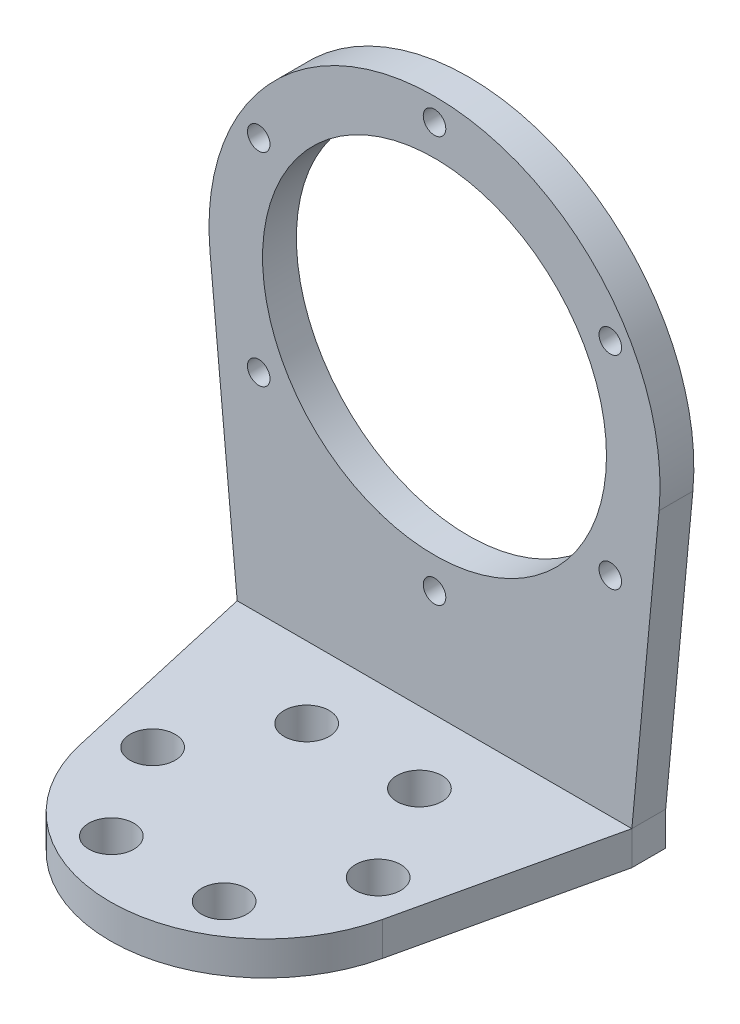
ISO-10303-21;
HEADER;
FILE_DESCRIPTION(('STEP AP214'),'2;1');
FILE_NAME('part.step','',(''),(''),'','','');
FILE_SCHEMA(('AUTOMOTIVE_DESIGN { 1 0 10303 214 1 1 1 1 }'));
ENDSEC;
DATA;
#1=APPLICATION_CONTEXT('core data for automotive mechanical design processes');
#2=APPLICATION_PROTOCOL_DEFINITION('international standard','automotive_design',2000,#1);
#3=PRODUCT_CONTEXT('',#1,'mechanical');
#4=PRODUCT('Part','Part','',(#3));
#5=PRODUCT_RELATED_PRODUCT_CATEGORY('part','',(#4));
#6=PRODUCT_DEFINITION_FORMATION('','',#4);
#7=PRODUCT_DEFINITION_CONTEXT('part definition',#1,'design');
#8=PRODUCT_DEFINITION('design','',#6,#7);
#9=PRODUCT_DEFINITION_SHAPE('','',#8);
#10=(LENGTH_UNIT() NAMED_UNIT(*) SI_UNIT(.MILLI.,.METRE.));
#11=(NAMED_UNIT(*) PLANE_ANGLE_UNIT() SI_UNIT($,.RADIAN.));
#12=(NAMED_UNIT(*) SI_UNIT($,.STERADIAN.) SOLID_ANGLE_UNIT());
#13=UNCERTAINTY_MEASURE_WITH_UNIT(LENGTH_MEASURE(1.E-05),#10,'distance_accuracy_value','');
#14=(GEOMETRIC_REPRESENTATION_CONTEXT(3) GLOBAL_UNCERTAINTY_ASSIGNED_CONTEXT((#13)) GLOBAL_UNIT_ASSIGNED_CONTEXT((#10,
#11,#12)) REPRESENTATION_CONTEXT('',''));
#15=CARTESIAN_POINT('',(0.,0.,0.));
#16=DIRECTION('',(0.,0.,1.));
#17=DIRECTION('',(1.,0.,0.));
#18=AXIS2_PLACEMENT_3D('',#15,#16,#17);
#19=CARTESIAN_POINT('',(35.,0.,28.75));
#20=DIRECTION('',(0.,1.,0.));
#21=DIRECTION('',(1.,0.,0.));
#22=AXIS2_PLACEMENT_3D('',#19,#20,#21);
#23=PLANE('',#22);
#24=CARTESIAN_POINT('',(45.,0.,47.3205080756888));
#25=DIRECTION('',(0.,1.,0.));
#26=DIRECTION('',(1.,0.,0.));
#27=AXIS2_PLACEMENT_3D('',#24,#25,#26);
#28=CIRCLE('',#27,4.);
#29=CARTESIAN_POINT('',(41.,0.,47.3205080756888));
#30=VERTEX_POINT('',#29);
#31=EDGE_CURVE('E246',#30,#30,#28,.T.);
#32=ORIENTED_EDGE('',*,*,#31,.T.);
#33=EDGE_LOOP('',(#32));
#34=FACE_BOUND('',#33,.T.);
#35=CARTESIAN_POINT('',(45.,0.,12.6794919243112));
#36=DIRECTION('',(0.,1.,0.));
#37=DIRECTION('',(1.,0.,0.));
#38=AXIS2_PLACEMENT_3D('',#35,#36,#37);
#39=CIRCLE('',#38,4.);
#40=CARTESIAN_POINT('',(41.,0.,12.6794919243112));
#41=VERTEX_POINT('',#40);
#42=EDGE_CURVE('E346',#41,#41,#39,.T.);
#43=ORIENTED_EDGE('',*,*,#42,.T.);
#44=EDGE_LOOP('',(#43));
#45=FACE_BOUND('',#44,.T.);
#46=CARTESIAN_POINT('',(25.,0.,12.6794919243112));
#47=DIRECTION('',(0.,1.,0.));
#48=DIRECTION('',(1.,0.,0.));
#49=AXIS2_PLACEMENT_3D('',#46,#47,#48);
#50=CIRCLE('',#49,4.);
#51=CARTESIAN_POINT('',(21.,0.,12.6794919243112));
#52=VERTEX_POINT('',#51);
#53=EDGE_CURVE('E374',#52,#52,#50,.T.);
#54=ORIENTED_EDGE('',*,*,#53,.T.);
#55=EDGE_LOOP('',(#54));
#56=FACE_BOUND('',#55,.T.);
#57=CARTESIAN_POINT('',(25.,0.,47.3205080756888));
#58=DIRECTION('',(0.,1.,0.));
#59=DIRECTION('',(1.,0.,0.));
#60=AXIS2_PLACEMENT_3D('',#57,#58,#59);
#61=CIRCLE('',#60,4.);
#62=CARTESIAN_POINT('',(21.,0.,47.3205080756888));
#63=VERTEX_POINT('',#62);
#64=EDGE_CURVE('E136',#63,#63,#61,.T.);
#65=ORIENTED_EDGE('',*,*,#64,.T.);
#66=EDGE_LOOP('',(#65));
#67=FACE_BOUND('',#66,.T.);
#68=CARTESIAN_POINT('',(55.,0.,30.));
#69=DIRECTION('',(0.,1.,0.));
#70=DIRECTION('',(1.,0.,0.));
#71=AXIS2_PLACEMENT_3D('',#68,#69,#70);
#72=CIRCLE('',#71,4.);
#73=CARTESIAN_POINT('',(51.,0.,30.));
#74=VERTEX_POINT('',#73);
#75=EDGE_CURVE('E338',#74,#74,#72,.T.);
#76=ORIENTED_EDGE('',*,*,#75,.T.);
#77=EDGE_LOOP('',(#76));
#78=FACE_BOUND('',#77,.T.);
#79=CARTESIAN_POINT('',(15.,0.,30.));
#80=DIRECTION('',(0.,1.,0.));
#81=DIRECTION('',(1.,0.,0.));
#82=AXIS2_PLACEMENT_3D('',#79,#80,#81);
#83=CIRCLE('',#82,4.);
#84=CARTESIAN_POINT('',(11.,0.,30.));
#85=VERTEX_POINT('',#84);
#86=EDGE_CURVE('E287',#85,#85,#83,.T.);
#87=ORIENTED_EDGE('',*,*,#86,.T.);
#88=EDGE_LOOP('',(#87));
#89=FACE_BOUND('',#88,.T.);
#90=DIRECTION('',(0.221120824168478,0.,-0.975246420715838));
#91=VECTOR('',#90,1.);
#92=CARTESIAN_POINT('',(61.8192765696855,0.,36.0808226646331));
#93=LINE('',#92,#91);
#94=CARTESIAN_POINT('',(61.8192765696855,0.,36.0808226646331));
#95=VERTEX_POINT('',#94);
#96=CARTESIAN_POINT('',(70.,0.,0.));
#97=VERTEX_POINT('',#96);
#98=EDGE_CURVE('E28',#95,#97,#93,.T.);
#99=ORIENTED_EDGE('',*,*,#98,.F.);
#100=CARTESIAN_POINT('',(35.,0.,30.));
#101=DIRECTION('',(0.,1.,0.));
#102=DIRECTION('',(-0.975246420715838,0.,0.221120824168478));
#103=AXIS2_PLACEMENT_3D('',#100,#101,#102);
#104=CIRCLE('',#103,27.5);
#105=CARTESIAN_POINT('',(8.18072343031444,0.,36.0808226646331));
#106=VERTEX_POINT('',#105);
#107=EDGE_CURVE('E238',#106,#95,#104,.T.);
#108=ORIENTED_EDGE('',*,*,#107,.F.);
#109=DIRECTION('',(0.221120824168477,0.,0.975246420715838));
#110=VECTOR('',#109,1.);
#111=CARTESIAN_POINT('',(0.,0.,0.));
#112=LINE('',#111,#110);
#113=CARTESIAN_POINT('',(0.,0.,0.));
#114=VERTEX_POINT('',#113);
#115=EDGE_CURVE('E221',#114,#106,#112,.T.);
#116=ORIENTED_EDGE('',*,*,#115,.F.);
#117=DIRECTION('',(0.,0.,-1.));
#118=VECTOR('',#117,1.);
#119=CARTESIAN_POINT('',(0.,0.,0.));
#120=LINE('',#119,#118);
#121=CARTESIAN_POINT('',(0.,0.,-6.));
#122=VERTEX_POINT('',#121);
#123=EDGE_CURVE('E271',#114,#122,#120,.T.);
#124=ORIENTED_EDGE('',*,*,#123,.T.);
#125=DIRECTION('',(1.,0.,0.));
#126=VECTOR('',#125,1.);
#127=CARTESIAN_POINT('',(0.,0.,-6.));
#128=LINE('',#127,#126);
#129=CARTESIAN_POINT('',(70.,0.,-6.));
#130=VERTEX_POINT('',#129);
#131=EDGE_CURVE('E300',#122,#130,#128,.T.);
#132=ORIENTED_EDGE('',*,*,#131,.T.);
#133=DIRECTION('',(0.,0.,1.));
#134=VECTOR('',#133,1.);
#135=CARTESIAN_POINT('',(70.,0.,-6.));
#136=LINE('',#135,#134);
#137=EDGE_CURVE('E422',#130,#97,#136,.T.);
#138=ORIENTED_EDGE('',*,*,#137,.T.);
#139=EDGE_LOOP('',(#99,#108,#116,#124,#132,#138));
#140=FACE_BOUND('',#139,.T.);
#141=ADVANCED_FACE('F17',(#34,#45,#56,#67,#78,#89,#140),#23,.F.);
#142=CARTESIAN_POINT('',(35.,6.,28.75));
#143=DIRECTION('',(0.,1.,0.));
#144=DIRECTION('',(1.,0.,0.));
#145=AXIS2_PLACEMENT_3D('',#142,#143,#144);
#146=PLANE('',#145);
#147=CARTESIAN_POINT('',(45.,6.,47.3205080756888));
#148=DIRECTION('',(0.,-1.,0.));
#149=DIRECTION('',(1.,0.,0.));
#150=AXIS2_PLACEMENT_3D('',#147,#148,#149);
#151=CIRCLE('',#150,4.);
#152=CARTESIAN_POINT('',(41.,6.,47.3205080756888));
#153=VERTEX_POINT('',#152);
#154=EDGE_CURVE('E349',#153,#153,#151,.T.);
#155=ORIENTED_EDGE('',*,*,#154,.T.);
#156=EDGE_LOOP('',(#155));
#157=FACE_BOUND('',#156,.T.);
#158=CARTESIAN_POINT('',(45.,6.,12.6794919243112));
#159=DIRECTION('',(0.,-1.,0.));
#160=DIRECTION('',(1.,0.,0.));
#161=AXIS2_PLACEMENT_3D('',#158,#159,#160);
#162=CIRCLE('',#161,4.);
#163=CARTESIAN_POINT('',(41.,6.,12.6794919243112));
#164=VERTEX_POINT('',#163);
#165=EDGE_CURVE('E382',#164,#164,#162,.T.);
#166=ORIENTED_EDGE('',*,*,#165,.T.);
#167=EDGE_LOOP('',(#166));
#168=FACE_BOUND('',#167,.T.);
#169=CARTESIAN_POINT('',(25.,6.,12.6794919243112));
#170=DIRECTION('',(0.,-1.,0.));
#171=DIRECTION('',(1.,0.,0.));
#172=AXIS2_PLACEMENT_3D('',#169,#170,#171);
#173=CIRCLE('',#172,4.);
#174=CARTESIAN_POINT('',(21.,6.,12.6794919243112));
#175=VERTEX_POINT('',#174);
#176=EDGE_CURVE('E345',#175,#175,#173,.T.);
#177=ORIENTED_EDGE('',*,*,#176,.T.);
#178=EDGE_LOOP('',(#177));
#179=FACE_BOUND('',#178,.T.);
#180=CARTESIAN_POINT('',(25.,6.,47.3205080756888));
#181=DIRECTION('',(0.,-1.,0.));
#182=DIRECTION('',(1.,0.,0.));
#183=AXIS2_PLACEMENT_3D('',#180,#181,#182);
#184=CIRCLE('',#183,4.);
#185=CARTESIAN_POINT('',(21.,6.,47.3205080756888));
#186=VERTEX_POINT('',#185);
#187=EDGE_CURVE('E341',#186,#186,#184,.T.);
#188=ORIENTED_EDGE('',*,*,#187,.T.);
#189=EDGE_LOOP('',(#188));
#190=FACE_BOUND('',#189,.T.);
#191=CARTESIAN_POINT('',(55.,6.,30.));
#192=DIRECTION('',(0.,-1.,0.));
#193=DIRECTION('',(1.,0.,0.));
#194=AXIS2_PLACEMENT_3D('',#191,#192,#193);
#195=CIRCLE('',#194,4.);
#196=CARTESIAN_POINT('',(51.,6.,30.));
#197=VERTEX_POINT('',#196);
#198=EDGE_CURVE('E292',#197,#197,#195,.T.);
#199=ORIENTED_EDGE('',*,*,#198,.T.);
#200=EDGE_LOOP('',(#199));
#201=FACE_BOUND('',#200,.T.);
#202=CARTESIAN_POINT('',(15.,6.,30.));
#203=DIRECTION('',(0.,-1.,0.));
#204=DIRECTION('',(1.,0.,0.));
#205=AXIS2_PLACEMENT_3D('',#202,#203,#204);
#206=CIRCLE('',#205,4.);
#207=CARTESIAN_POINT('',(11.,6.,30.));
#208=VERTEX_POINT('',#207);
#209=EDGE_CURVE('E288',#208,#208,#206,.T.);
#210=ORIENTED_EDGE('',*,*,#209,.T.);
#211=EDGE_LOOP('',(#210));
#212=FACE_BOUND('',#211,.T.);
#213=DIRECTION('',(0.221120824168478,0.,-0.975246420715838));
#214=VECTOR('',#213,1.);
#215=CARTESIAN_POINT('',(61.8192765696855,6.,36.0808226646331));
#216=LINE('',#215,#214);
#217=CARTESIAN_POINT('',(61.8192765696855,6.,36.0808226646331));
#218=VERTEX_POINT('',#217);
#219=CARTESIAN_POINT('',(70.,6.,0.));
#220=VERTEX_POINT('',#219);
#221=EDGE_CURVE('E11',#218,#220,#216,.T.);
#222=ORIENTED_EDGE('',*,*,#221,.T.);
#223=DIRECTION('',(-1.,0.,0.));
#224=VECTOR('',#223,1.);
#225=CARTESIAN_POINT('',(70.,6.,0.));
#226=LINE('',#225,#224);
#227=CARTESIAN_POINT('',(0.,6.,0.));
#228=VERTEX_POINT('',#227);
#229=EDGE_CURVE('E297',#220,#228,#226,.T.);
#230=ORIENTED_EDGE('',*,*,#229,.T.);
#231=DIRECTION('',(0.221120824168477,0.,0.975246420715838));
#232=VECTOR('',#231,1.);
#233=CARTESIAN_POINT('',(0.,6.,0.));
#234=LINE('',#233,#232);
#235=CARTESIAN_POINT('',(8.18072343031444,6.,36.0808226646331));
#236=VERTEX_POINT('',#235);
#237=EDGE_CURVE('E42',#228,#236,#234,.T.);
#238=ORIENTED_EDGE('',*,*,#237,.T.);
#239=CARTESIAN_POINT('',(35.,6.,30.));
#240=DIRECTION('',(0.,1.,0.));
#241=DIRECTION('',(-0.975246420715838,0.,0.221120824168478));
#242=AXIS2_PLACEMENT_3D('',#239,#240,#241);
#243=CIRCLE('',#242,27.5);
#244=EDGE_CURVE('E239',#236,#218,#243,.T.);
#245=ORIENTED_EDGE('',*,*,#244,.T.);
#246=EDGE_LOOP('',(#222,#230,#238,#245));
#247=FACE_BOUND('',#246,.T.);
#248=ADVANCED_FACE('F682',(#157,#168,#179,#190,#201,#212,#247),#146,.T.);
#249=CARTESIAN_POINT('',(61.8192765696855,0.,36.0808226646331));
#250=DIRECTION('',(0.975246420715838,0.,0.221120824168478));
#251=DIRECTION('',(0.,-1.,0.));
#252=AXIS2_PLACEMENT_3D('',#249,#250,#251);
#253=PLANE('',#252);
#254=ORIENTED_EDGE('',*,*,#98,.T.);
#255=DIRECTION('',(0.,1.,0.));
#256=VECTOR('',#255,1.);
#257=CARTESIAN_POINT('',(70.,0.,0.));
#258=LINE('',#257,#256);
#259=EDGE_CURVE('E418',#97,#220,#258,.T.);
#260=ORIENTED_EDGE('',*,*,#259,.T.);
#261=ORIENTED_EDGE('',*,*,#221,.F.);
#262=DIRECTION('',(0.,1.,0.));
#263=VECTOR('',#262,1.);
#264=CARTESIAN_POINT('',(61.8192765696855,0.,36.0808226646331));
#265=LINE('',#264,#263);
#266=EDGE_CURVE('E245',#95,#218,#265,.T.);
#267=ORIENTED_EDGE('',*,*,#266,.F.);
#268=EDGE_LOOP('',(#254,#260,#261,#267));
#269=FACE_BOUND('',#268,.T.);
#270=ADVANCED_FACE('F681',(#269),#253,.T.);
#271=CARTESIAN_POINT('',(0.,0.,0.));
#272=DIRECTION('',(-0.975246420715838,0.,0.221120824168477));
#273=DIRECTION('',(0.,1.,0.));
#274=AXIS2_PLACEMENT_3D('',#271,#272,#273);
#275=PLANE('',#274);
#276=ORIENTED_EDGE('',*,*,#115,.T.);
#277=DIRECTION('',(0.,1.,0.));
#278=VECTOR('',#277,1.);
#279=CARTESIAN_POINT('',(8.18072343031444,0.,36.0808226646331));
#280=LINE('',#279,#278);
#281=EDGE_CURVE('E224',#106,#236,#280,.T.);
#282=ORIENTED_EDGE('',*,*,#281,.T.);
#283=ORIENTED_EDGE('',*,*,#237,.F.);
#284=DIRECTION('',(0.,1.,0.));
#285=VECTOR('',#284,1.);
#286=CARTESIAN_POINT('',(0.,0.,0.));
#287=LINE('',#286,#285);
#288=EDGE_CURVE('E227',#114,#228,#287,.T.);
#289=ORIENTED_EDGE('',*,*,#288,.F.);
#290=EDGE_LOOP('',(#276,#282,#283,#289));
#291=FACE_BOUND('',#290,.T.);
#292=ADVANCED_FACE('F223',(#291),#275,.T.);
#293=CARTESIAN_POINT('',(35.,0.,30.));
#294=DIRECTION('',(0.,1.,0.));
#295=DIRECTION('',(-0.975246420715838,0.,0.221120824168478));
#296=AXIS2_PLACEMENT_3D('',#293,#294,#295);
#297=CYLINDRICAL_SURFACE('',#296,27.5);
#298=ORIENTED_EDGE('',*,*,#107,.T.);
#299=ORIENTED_EDGE('',*,*,#266,.T.);
#300=ORIENTED_EDGE('',*,*,#244,.F.);
#301=ORIENTED_EDGE('',*,*,#281,.F.);
#302=EDGE_LOOP('',(#298,#299,#300,#301));
#303=FACE_BOUND('',#302,.T.);
#304=ADVANCED_FACE('F236',(#303),#297,.T.);
#305=CARTESIAN_POINT('',(45.,6.,47.3205080756888));
#306=DIRECTION('',(0.,-1.,0.));
#307=DIRECTION('',(1.,0.,0.));
#308=AXIS2_PLACEMENT_3D('',#305,#306,#307);
#309=CYLINDRICAL_SURFACE('',#308,4.);
#310=ORIENTED_EDGE('',*,*,#154,.F.);
#311=DIRECTION('',(0.,-1.,0.));
#312=VECTOR('',#311,1.);
#313=CARTESIAN_POINT('',(41.,6.,47.3205080756888));
#314=LINE('',#313,#312);
#315=EDGE_CURVE('E254',#153,#30,#314,.T.);
#316=ORIENTED_EDGE('',*,*,#315,.T.);
#317=ORIENTED_EDGE('',*,*,#31,.F.);
#318=ORIENTED_EDGE('',*,*,#315,.F.);
#319=EDGE_LOOP('',(#310,#316,#317,#318));
#320=FACE_BOUND('',#319,.T.);
#321=ADVANCED_FACE('F708',(#320),#309,.F.);
#322=CARTESIAN_POINT('',(45.,6.,12.6794919243112));
#323=DIRECTION('',(0.,-1.,0.));
#324=DIRECTION('',(1.,0.,0.));
#325=AXIS2_PLACEMENT_3D('',#322,#323,#324);
#326=CYLINDRICAL_SURFACE('',#325,4.);
#327=ORIENTED_EDGE('',*,*,#165,.F.);
#328=DIRECTION('',(0.,-1.,0.));
#329=VECTOR('',#328,1.);
#330=CARTESIAN_POINT('',(41.,6.,12.6794919243112));
#331=LINE('',#330,#329);
#332=EDGE_CURVE('E350',#164,#41,#331,.T.);
#333=ORIENTED_EDGE('',*,*,#332,.T.);
#334=ORIENTED_EDGE('',*,*,#42,.F.);
#335=ORIENTED_EDGE('',*,*,#332,.F.);
#336=EDGE_LOOP('',(#327,#333,#334,#335));
#337=FACE_BOUND('',#336,.T.);
#338=ADVANCED_FACE('F706',(#337),#326,.F.);
#339=CARTESIAN_POINT('',(25.,6.,12.6794919243112));
#340=DIRECTION('',(0.,-1.,0.));
#341=DIRECTION('',(1.,0.,0.));
#342=AXIS2_PLACEMENT_3D('',#339,#340,#341);
#343=CYLINDRICAL_SURFACE('',#342,4.);
#344=ORIENTED_EDGE('',*,*,#176,.F.);
#345=DIRECTION('',(0.,-1.,0.));
#346=VECTOR('',#345,1.);
#347=CARTESIAN_POINT('',(21.,6.,12.6794919243112));
#348=LINE('',#347,#346);
#349=EDGE_CURVE('E371',#175,#52,#348,.T.);
#350=ORIENTED_EDGE('',*,*,#349,.T.);
#351=ORIENTED_EDGE('',*,*,#53,.F.);
#352=ORIENTED_EDGE('',*,*,#349,.F.);
#353=EDGE_LOOP('',(#344,#350,#351,#352));
#354=FACE_BOUND('',#353,.T.);
#355=ADVANCED_FACE('F702',(#354),#343,.F.);
#356=CARTESIAN_POINT('',(25.,6.,47.3205080756888));
#357=DIRECTION('',(0.,-1.,0.));
#358=DIRECTION('',(1.,0.,0.));
#359=AXIS2_PLACEMENT_3D('',#356,#357,#358);
#360=CYLINDRICAL_SURFACE('',#359,4.);
#361=ORIENTED_EDGE('',*,*,#187,.F.);
#362=DIRECTION('',(0.,-1.,0.));
#363=VECTOR('',#362,1.);
#364=CARTESIAN_POINT('',(21.,6.,47.3205080756888));
#365=LINE('',#364,#363);
#366=EDGE_CURVE('E149',#186,#63,#365,.T.);
#367=ORIENTED_EDGE('',*,*,#366,.T.);
#368=ORIENTED_EDGE('',*,*,#64,.F.);
#369=ORIENTED_EDGE('',*,*,#366,.F.);
#370=EDGE_LOOP('',(#361,#367,#368,#369));
#371=FACE_BOUND('',#370,.T.);
#372=ADVANCED_FACE('F705',(#371),#360,.F.);
#373=CARTESIAN_POINT('',(55.,6.,30.));
#374=DIRECTION('',(0.,-1.,0.));
#375=DIRECTION('',(1.,0.,0.));
#376=AXIS2_PLACEMENT_3D('',#373,#374,#375);
#377=CYLINDRICAL_SURFACE('',#376,4.);
#378=ORIENTED_EDGE('',*,*,#198,.F.);
#379=DIRECTION('',(0.,-1.,0.));
#380=VECTOR('',#379,1.);
#381=CARTESIAN_POINT('',(51.,6.,30.));
#382=LINE('',#381,#380);
#383=EDGE_CURVE('E342',#197,#74,#382,.T.);
#384=ORIENTED_EDGE('',*,*,#383,.T.);
#385=ORIENTED_EDGE('',*,*,#75,.F.);
#386=ORIENTED_EDGE('',*,*,#383,.F.);
#387=EDGE_LOOP('',(#378,#384,#385,#386));
#388=FACE_BOUND('',#387,.T.);
#389=ADVANCED_FACE('F721',(#388),#377,.F.);
#390=CARTESIAN_POINT('',(15.,6.,30.));
#391=DIRECTION('',(0.,-1.,0.));
#392=DIRECTION('',(1.,0.,0.));
#393=AXIS2_PLACEMENT_3D('',#390,#391,#392);
#394=CYLINDRICAL_SURFACE('',#393,4.);
#395=ORIENTED_EDGE('',*,*,#209,.F.);
#396=DIRECTION('',(0.,-1.,0.));
#397=VECTOR('',#396,1.);
#398=CARTESIAN_POINT('',(11.,6.,30.));
#399=LINE('',#398,#397);
#400=EDGE_CURVE('E283',#208,#85,#399,.T.);
#401=ORIENTED_EDGE('',*,*,#400,.T.);
#402=ORIENTED_EDGE('',*,*,#86,.F.);
#403=ORIENTED_EDGE('',*,*,#400,.F.);
#404=EDGE_LOOP('',(#395,#401,#402,#403));
#405=FACE_BOUND('',#404,.T.);
#406=ADVANCED_FACE('F718',(#405),#394,.F.);
#407=CARTESIAN_POINT('',(35.,53.5,-6.));
#408=DIRECTION('',(0.,0.,1.));
#409=DIRECTION('',(1.,0.,0.));
#410=AXIS2_PLACEMENT_3D('',#407,#408,#409);
#411=PLANE('',#410);
#412=CARTESIAN_POINT('',(35.,61.,-6.));
#413=DIRECTION('',(0.,0.,1.));
#414=DIRECTION('',(-1.,0.,0.));
#415=AXIS2_PLACEMENT_3D('',#412,#413,#414);
#416=CIRCLE('',#415,30.5);
#417=CARTESIAN_POINT('',(65.5,61.,-6.));
#418=VERTEX_POINT('',#417);
#419=EDGE_CURVE('E260',#418,#418,#416,.T.);
#420=ORIENTED_EDGE('',*,*,#419,.T.);
#421=EDGE_LOOP('',(#420));
#422=FACE_BOUND('',#421,.T.);
#423=CARTESIAN_POINT('',(66.1769145362398,79.,-6.));
#424=DIRECTION('',(0.,0.,1.));
#425=DIRECTION('',(1.,0.,0.));
#426=AXIS2_PLACEMENT_3D('',#423,#424,#425);
#427=CIRCLE('',#426,2.);
#428=CARTESIAN_POINT('',(64.1769145362398,79.,-6.));
#429=VERTEX_POINT('',#428);
#430=EDGE_CURVE('E322',#429,#429,#427,.T.);
#431=ORIENTED_EDGE('',*,*,#430,.T.);
#432=EDGE_LOOP('',(#431));
#433=FACE_BOUND('',#432,.T.);
#434=CARTESIAN_POINT('',(35.,25.,-6.));
#435=DIRECTION('',(0.,0.,1.));
#436=DIRECTION('',(1.,0.,0.));
#437=AXIS2_PLACEMENT_3D('',#434,#435,#436);
#438=CIRCLE('',#437,2.);
#439=CARTESIAN_POINT('',(33.,25.,-6.));
#440=VERTEX_POINT('',#439);
#441=EDGE_CURVE('E337',#440,#440,#438,.T.);
#442=ORIENTED_EDGE('',*,*,#441,.T.);
#443=EDGE_LOOP('',(#442));
#444=FACE_BOUND('',#443,.T.);
#445=CARTESIAN_POINT('',(3.8230854637602,43.,-6.));
#446=DIRECTION('',(0.,0.,1.));
#447=DIRECTION('',(1.,0.,0.));
#448=AXIS2_PLACEMENT_3D('',#445,#446,#447);
#449=CIRCLE('',#448,2.);
#450=CARTESIAN_POINT('',(1.8230854637602,43.,-6.));
#451=VERTEX_POINT('',#450);
#452=EDGE_CURVE('E312',#451,#451,#449,.T.);
#453=ORIENTED_EDGE('',*,*,#452,.T.);
#454=EDGE_LOOP('',(#453));
#455=FACE_BOUND('',#454,.T.);
#456=CARTESIAN_POINT('',(3.82308546376022,79.,-6.));
#457=DIRECTION('',(0.,0.,1.));
#458=DIRECTION('',(1.,0.,0.));
#459=AXIS2_PLACEMENT_3D('',#456,#457,#458);
#460=CIRCLE('',#459,2.);
#461=CARTESIAN_POINT('',(1.82308546376022,79.,-6.));
#462=VERTEX_POINT('',#461);
#463=EDGE_CURVE('E318',#462,#462,#460,.T.);
#464=ORIENTED_EDGE('',*,*,#463,.T.);
#465=EDGE_LOOP('',(#464));
#466=FACE_BOUND('',#465,.T.);
#467=CARTESIAN_POINT('',(66.1769145362398,43.,-6.));
#468=DIRECTION('',(0.,0.,1.));
#469=DIRECTION('',(1.,0.,0.));
#470=AXIS2_PLACEMENT_3D('',#467,#468,#469);
#471=CIRCLE('',#470,2.);
#472=CARTESIAN_POINT('',(64.1769145362398,43.,-6.));
#473=VERTEX_POINT('',#472);
#474=EDGE_CURVE('E306',#473,#473,#471,.T.);
#475=ORIENTED_EDGE('',*,*,#474,.T.);
#476=EDGE_LOOP('',(#475));
#477=FACE_BOUND('',#476,.T.);
#478=CARTESIAN_POINT('',(35.,97.,-6.));
#479=DIRECTION('',(0.,0.,1.));
#480=DIRECTION('',(1.,0.,0.));
#481=AXIS2_PLACEMENT_3D('',#478,#479,#480);
#482=CIRCLE('',#481,2.);
#483=CARTESIAN_POINT('',(33.,97.,-6.));
#484=VERTEX_POINT('',#483);
#485=EDGE_CURVE('E216',#484,#484,#482,.T.);
#486=ORIENTED_EDGE('',*,*,#485,.T.);
#487=EDGE_LOOP('',(#486));
#488=FACE_BOUND('',#487,.T.);
#489=DIRECTION('',(-0.0937093471358292,-0.995599597357982,0.));
#490=VECTOR('',#489,1.);
#491=CARTESIAN_POINT('',(70.,6.,-6.));
#492=LINE('',#491,#490);
#493=CARTESIAN_POINT('',(74.8239838943193,57.2516261145668,-6.));
#494=VERTEX_POINT('',#493);
#495=CARTESIAN_POINT('',(70.,6.,-6.));
#496=VERTEX_POINT('',#495);
#497=EDGE_CURVE('E280',#494,#496,#492,.T.);
#498=ORIENTED_EDGE('',*,*,#497,.T.);
#499=DIRECTION('',(0.,-1.,0.));
#500=VECTOR('',#499,1.);
#501=CARTESIAN_POINT('',(70.,6.,-6.));
#502=LINE('',#501,#500);
#503=EDGE_CURVE('E265',#496,#130,#502,.T.);
#504=ORIENTED_EDGE('',*,*,#503,.T.);
#505=ORIENTED_EDGE('',*,*,#131,.F.);
#506=DIRECTION('',(0.,-1.,0.));
#507=VECTOR('',#506,1.);
#508=CARTESIAN_POINT('',(0.,6.,-6.));
#509=LINE('',#508,#507);
#510=CARTESIAN_POINT('',(0.,6.,-6.));
#511=VERTEX_POINT('',#510);
#512=EDGE_CURVE('E21',#511,#122,#509,.T.);
#513=ORIENTED_EDGE('',*,*,#512,.F.);
#514=DIRECTION('',(-0.0937093471358294,0.995599597357982,0.));
#515=VECTOR('',#514,1.);
#516=CARTESIAN_POINT('',(-4.82398389431929,57.2516261145668,-6.));
#517=LINE('',#516,#515);
#518=CARTESIAN_POINT('',(-4.82398389431929,57.2516261145668,-6.));
#519=VERTEX_POINT('',#518);
#520=EDGE_CURVE('E281',#511,#519,#517,.T.);
#521=ORIENTED_EDGE('',*,*,#520,.T.);
#522=CARTESIAN_POINT('',(35.,61.,-6.));
#523=DIRECTION('',(0.,0.,-1.));
#524=DIRECTION('',(1.,0.,0.));
#525=AXIS2_PLACEMENT_3D('',#522,#523,#524);
#526=CIRCLE('',#525,40.);
#527=EDGE_CURVE('E276',#519,#494,#526,.T.);
#528=ORIENTED_EDGE('',*,*,#527,.T.);
#529=EDGE_LOOP('',(#498,#504,#505,#513,#521,#528));
#530=FACE_BOUND('',#529,.T.);
#531=ADVANCED_FACE('F470',(#422,#433,#444,#455,#466,#477,#488,#530),#411,.F.);
#532=CARTESIAN_POINT('',(35.,53.5,0.));
#533=DIRECTION('',(0.,0.,1.));
#534=DIRECTION('',(1.,0.,0.));
#535=AXIS2_PLACEMENT_3D('',#532,#533,#534);
#536=PLANE('',#535);
#537=CARTESIAN_POINT('',(35.,61.,0.));
#538=DIRECTION('',(0.,0.,-1.));
#539=DIRECTION('',(-1.,0.,0.));
#540=AXIS2_PLACEMENT_3D('',#537,#538,#539);
#541=CIRCLE('',#540,30.5);
#542=CARTESIAN_POINT('',(65.5,61.,0.));
#543=VERTEX_POINT('',#542);
#544=EDGE_CURVE('E366',#543,#543,#541,.T.);
#545=ORIENTED_EDGE('',*,*,#544,.T.);
#546=EDGE_LOOP('',(#545));
#547=FACE_BOUND('',#546,.T.);
#548=CARTESIAN_POINT('',(66.1769145362398,79.,0.));
#549=DIRECTION('',(0.,0.,-1.));
#550=DIRECTION('',(1.,0.,0.));
#551=AXIS2_PLACEMENT_3D('',#548,#549,#550);
#552=CIRCLE('',#551,2.);
#553=CARTESIAN_POINT('',(64.1769145362398,79.,0.));
#554=VERTEX_POINT('',#553);
#555=EDGE_CURVE('E398',#554,#554,#552,.T.);
#556=ORIENTED_EDGE('',*,*,#555,.T.);
#557=EDGE_LOOP('',(#556));
#558=FACE_BOUND('',#557,.T.);
#559=CARTESIAN_POINT('',(35.,25.,0.));
#560=DIRECTION('',(0.,0.,-1.));
#561=DIRECTION('',(1.,0.,0.));
#562=AXIS2_PLACEMENT_3D('',#559,#560,#561);
#563=CIRCLE('',#562,2.);
#564=CARTESIAN_POINT('',(33.,25.,0.));
#565=VERTEX_POINT('',#564);
#566=EDGE_CURVE('E307',#565,#565,#563,.T.);
#567=ORIENTED_EDGE('',*,*,#566,.T.);
#568=EDGE_LOOP('',(#567));
#569=FACE_BOUND('',#568,.T.);
#570=CARTESIAN_POINT('',(3.8230854637602,43.,0.));
#571=DIRECTION('',(0.,0.,-1.));
#572=DIRECTION('',(1.,0.,0.));
#573=AXIS2_PLACEMENT_3D('',#570,#571,#572);
#574=CIRCLE('',#573,2.);
#575=CARTESIAN_POINT('',(1.8230854637602,43.,0.));
#576=VERTEX_POINT('',#575);
#577=EDGE_CURVE('E313',#576,#576,#574,.T.);
#578=ORIENTED_EDGE('',*,*,#577,.T.);
#579=EDGE_LOOP('',(#578));
#580=FACE_BOUND('',#579,.T.);
#581=CARTESIAN_POINT('',(3.82308546376022,79.,0.));
#582=DIRECTION('',(0.,0.,-1.));
#583=DIRECTION('',(1.,0.,0.));
#584=AXIS2_PLACEMENT_3D('',#581,#582,#583);
#585=CIRCLE('',#584,2.);
#586=CARTESIAN_POINT('',(1.82308546376022,79.,0.));
#587=VERTEX_POINT('',#586);
#588=EDGE_CURVE('E301',#587,#587,#585,.T.);
#589=ORIENTED_EDGE('',*,*,#588,.T.);
#590=EDGE_LOOP('',(#589));
#591=FACE_BOUND('',#590,.T.);
#592=CARTESIAN_POINT('',(66.1769145362398,43.,0.));
#593=DIRECTION('',(0.,0.,-1.));
#594=DIRECTION('',(1.,0.,0.));
#595=AXIS2_PLACEMENT_3D('',#592,#593,#594);
#596=CIRCLE('',#595,2.);
#597=CARTESIAN_POINT('',(64.1769145362398,43.,0.));
#598=VERTEX_POINT('',#597);
#599=EDGE_CURVE('E417',#598,#598,#596,.T.);
#600=ORIENTED_EDGE('',*,*,#599,.T.);
#601=EDGE_LOOP('',(#600));
#602=FACE_BOUND('',#601,.T.);
#603=CARTESIAN_POINT('',(35.,97.,0.));
#604=DIRECTION('',(0.,0.,-1.));
#605=DIRECTION('',(1.,0.,0.));
#606=AXIS2_PLACEMENT_3D('',#603,#604,#605);
#607=CIRCLE('',#606,2.);
#608=CARTESIAN_POINT('',(33.,97.,0.));
#609=VERTEX_POINT('',#608);
#610=EDGE_CURVE('E357',#609,#609,#607,.T.);
#611=ORIENTED_EDGE('',*,*,#610,.T.);
#612=EDGE_LOOP('',(#611));
#613=FACE_BOUND('',#612,.T.);
#614=DIRECTION('',(0.0937093471358292,0.995599597357982,0.));
#615=VECTOR('',#614,1.);
#616=CARTESIAN_POINT('',(70.,6.,0.));
#617=LINE('',#616,#615);
#618=CARTESIAN_POINT('',(74.8239838943193,57.2516261145668,0.));
#619=VERTEX_POINT('',#618);
#620=EDGE_CURVE('E278',#220,#619,#617,.T.);
#621=ORIENTED_EDGE('',*,*,#620,.T.);
#622=CARTESIAN_POINT('',(35.,61.,0.));
#623=DIRECTION('',(0.,0.,1.));
#624=DIRECTION('',(1.,0.,0.));
#625=AXIS2_PLACEMENT_3D('',#622,#623,#624);
#626=CIRCLE('',#625,40.);
#627=CARTESIAN_POINT('',(-4.82398389431929,57.2516261145668,0.));
#628=VERTEX_POINT('',#627);
#629=EDGE_CURVE('E277',#619,#628,#626,.T.);
#630=ORIENTED_EDGE('',*,*,#629,.T.);
#631=DIRECTION('',(0.0937093471358294,-0.995599597357982,0.));
#632=VECTOR('',#631,1.);
#633=CARTESIAN_POINT('',(-4.82398389431929,57.2516261145668,0.));
#634=LINE('',#633,#632);
#635=EDGE_CURVE('E258',#628,#228,#634,.T.);
#636=ORIENTED_EDGE('',*,*,#635,.T.);
#637=ORIENTED_EDGE('',*,*,#229,.F.);
#638=EDGE_LOOP('',(#621,#630,#636,#637));
#639=FACE_BOUND('',#638,.T.);
#640=ADVANCED_FACE('F669',(#547,#558,#569,#580,#591,#602,#613,#639),#536,.T.);
#641=CARTESIAN_POINT('',(74.8239838943193,57.2516261145668,0.));
#642=DIRECTION('',(0.995599597357982,-0.0937093471358292,0.));
#643=DIRECTION('',(0.,0.,-1.));
#644=AXIS2_PLACEMENT_3D('',#641,#642,#643);
#645=PLANE('',#644);
#646=ORIENTED_EDGE('',*,*,#620,.F.);
#647=DIRECTION('',(0.,0.,-1.));
#648=VECTOR('',#647,1.);
#649=CARTESIAN_POINT('',(70.,6.,0.));
#650=LINE('',#649,#648);
#651=EDGE_CURVE('E270',#220,#496,#650,.T.);
#652=ORIENTED_EDGE('',*,*,#651,.T.);
#653=ORIENTED_EDGE('',*,*,#497,.F.);
#654=DIRECTION('',(0.,0.,-1.));
#655=VECTOR('',#654,1.);
#656=CARTESIAN_POINT('',(74.8239838943193,57.2516261145668,0.));
#657=LINE('',#656,#655);
#658=EDGE_CURVE('E272',#619,#494,#657,.T.);
#659=ORIENTED_EDGE('',*,*,#658,.F.);
#660=EDGE_LOOP('',(#646,#652,#653,#659));
#661=FACE_BOUND('',#660,.T.);
#662=ADVANCED_FACE('F679',(#661),#645,.T.);
#663=CARTESIAN_POINT('',(0.,6.,0.));
#664=DIRECTION('',(-0.995599597357982,-0.0937093471358294,0.));
#665=DIRECTION('',(-0.0937093471358295,0.995599597357982,0.));
#666=AXIS2_PLACEMENT_3D('',#663,#664,#665);
#667=PLANE('',#666);
#668=ORIENTED_EDGE('',*,*,#635,.F.);
#669=DIRECTION('',(0.,0.,-1.));
#670=VECTOR('',#669,1.);
#671=CARTESIAN_POINT('',(-4.82398389431929,57.2516261145668,0.));
#672=LINE('',#671,#670);
#673=EDGE_CURVE('E296',#628,#519,#672,.T.);
#674=ORIENTED_EDGE('',*,*,#673,.T.);
#675=ORIENTED_EDGE('',*,*,#520,.F.);
#676=DIRECTION('',(0.,0.,-1.));
#677=VECTOR('',#676,1.);
#678=CARTESIAN_POINT('',(0.,6.,0.));
#679=LINE('',#678,#677);
#680=EDGE_CURVE('E326',#228,#511,#679,.T.);
#681=ORIENTED_EDGE('',*,*,#680,.F.);
#682=EDGE_LOOP('',(#668,#674,#675,#681));
#683=FACE_BOUND('',#682,.T.);
#684=ADVANCED_FACE('F19',(#683),#667,.T.);
#685=CARTESIAN_POINT('',(35.,61.,0.));
#686=DIRECTION('',(0.,0.,-1.));
#687=DIRECTION('',(0.,1.,0.));
#688=AXIS2_PLACEMENT_3D('',#685,#686,#687);
#689=CYLINDRICAL_SURFACE('',#688,40.);
#690=ORIENTED_EDGE('',*,*,#629,.F.);
#691=ORIENTED_EDGE('',*,*,#658,.T.);
#692=ORIENTED_EDGE('',*,*,#527,.F.);
#693=ORIENTED_EDGE('',*,*,#673,.F.);
#694=EDGE_LOOP('',(#690,#691,#692,#693));
#695=FACE_BOUND('',#694,.T.);
#696=ADVANCED_FACE('F677',(#695),#689,.T.);
#697=CARTESIAN_POINT('',(35.,61.,0.));
#698=DIRECTION('',(0.,0.,-1.));
#699=DIRECTION('',(-1.,0.,0.));
#700=AXIS2_PLACEMENT_3D('',#697,#698,#699);
#701=CYLINDRICAL_SURFACE('',#700,30.5);
#702=ORIENTED_EDGE('',*,*,#419,.F.);
#703=DIRECTION('',(0.,0.,1.));
#704=VECTOR('',#703,1.);
#705=CARTESIAN_POINT('',(65.5,61.,0.));
#706=LINE('',#705,#704);
#707=EDGE_CURVE('E264',#418,#543,#706,.T.);
#708=ORIENTED_EDGE('',*,*,#707,.T.);
#709=ORIENTED_EDGE('',*,*,#544,.F.);
#710=ORIENTED_EDGE('',*,*,#707,.F.);
#711=EDGE_LOOP('',(#702,#708,#709,#710));
#712=FACE_BOUND('',#711,.T.);
#713=ADVANCED_FACE('F701',(#712),#701,.F.);
#714=CARTESIAN_POINT('',(70.,6.,-6.));
#715=DIRECTION('',(1.,0.,0.));
#716=DIRECTION('',(0.,1.,0.));
#717=AXIS2_PLACEMENT_3D('',#714,#715,#716);
#718=PLANE('',#717);
#719=ORIENTED_EDGE('',*,*,#651,.F.);
#720=ORIENTED_EDGE('',*,*,#259,.F.);
#721=ORIENTED_EDGE('',*,*,#137,.F.);
#722=ORIENTED_EDGE('',*,*,#503,.F.);
#723=EDGE_LOOP('',(#719,#720,#721,#722));
#724=FACE_BOUND('',#723,.T.);
#725=ADVANCED_FACE('F475',(#724),#718,.T.);
#726=CARTESIAN_POINT('',(0.,6.,0.));
#727=DIRECTION('',(-1.,0.,0.));
#728=DIRECTION('',(0.,0.,1.));
#729=AXIS2_PLACEMENT_3D('',#726,#727,#728);
#730=PLANE('',#729);
#731=ORIENTED_EDGE('',*,*,#680,.T.);
#732=ORIENTED_EDGE('',*,*,#512,.T.);
#733=ORIENTED_EDGE('',*,*,#123,.F.);
#734=ORIENTED_EDGE('',*,*,#288,.T.);
#735=EDGE_LOOP('',(#731,#732,#733,#734));
#736=FACE_BOUND('',#735,.T.);
#737=ADVANCED_FACE('F478',(#736),#730,.T.);
#738=CARTESIAN_POINT('',(66.1769145362398,79.,0.));
#739=DIRECTION('',(0.,0.,-1.));
#740=DIRECTION('',(1.,0.,0.));
#741=AXIS2_PLACEMENT_3D('',#738,#739,#740);
#742=CYLINDRICAL_SURFACE('',#741,2.);
#743=ORIENTED_EDGE('',*,*,#555,.F.);
#744=DIRECTION('',(0.,0.,-1.));
#745=VECTOR('',#744,1.);
#746=CARTESIAN_POINT('',(64.1769145362398,79.,0.));
#747=LINE('',#746,#745);
#748=EDGE_CURVE('E327',#554,#429,#747,.T.);
#749=ORIENTED_EDGE('',*,*,#748,.T.);
#750=ORIENTED_EDGE('',*,*,#430,.F.);
#751=ORIENTED_EDGE('',*,*,#748,.F.);
#752=EDGE_LOOP('',(#743,#749,#750,#751));
#753=FACE_BOUND('',#752,.T.);
#754=ADVANCED_FACE('F727',(#753),#742,.F.);
#755=CARTESIAN_POINT('',(35.,25.,0.));
#756=DIRECTION('',(0.,0.,-1.));
#757=DIRECTION('',(1.,0.,0.));
#758=AXIS2_PLACEMENT_3D('',#755,#756,#757);
#759=CYLINDRICAL_SURFACE('',#758,2.);
#760=ORIENTED_EDGE('',*,*,#566,.F.);
#761=DIRECTION('',(0.,0.,-1.));
#762=VECTOR('',#761,1.);
#763=CARTESIAN_POINT('',(33.,25.,0.));
#764=LINE('',#763,#762);
#765=EDGE_CURVE('E311',#565,#440,#764,.T.);
#766=ORIENTED_EDGE('',*,*,#765,.T.);
#767=ORIENTED_EDGE('',*,*,#441,.F.);
#768=ORIENTED_EDGE('',*,*,#765,.F.);
#769=EDGE_LOOP('',(#760,#766,#767,#768));
#770=FACE_BOUND('',#769,.T.);
#771=ADVANCED_FACE('F723',(#770),#759,.F.);
#772=CARTESIAN_POINT('',(3.8230854637602,43.,0.));
#773=DIRECTION('',(0.,0.,-1.));
#774=DIRECTION('',(1.,0.,0.));
#775=AXIS2_PLACEMENT_3D('',#772,#773,#774);
#776=CYLINDRICAL_SURFACE('',#775,2.);
#777=ORIENTED_EDGE('',*,*,#577,.F.);
#778=DIRECTION('',(0.,0.,-1.));
#779=VECTOR('',#778,1.);
#780=CARTESIAN_POINT('',(1.8230854637602,43.,0.));
#781=LINE('',#780,#779);
#782=EDGE_CURVE('E317',#576,#451,#781,.T.);
#783=ORIENTED_EDGE('',*,*,#782,.T.);
#784=ORIENTED_EDGE('',*,*,#452,.F.);
#785=ORIENTED_EDGE('',*,*,#782,.F.);
#786=EDGE_LOOP('',(#777,#783,#784,#785));
#787=FACE_BOUND('',#786,.T.);
#788=ADVANCED_FACE('F726',(#787),#776,.F.);
#789=CARTESIAN_POINT('',(3.82308546376022,79.,0.));
#790=DIRECTION('',(0.,0.,-1.));
#791=DIRECTION('',(1.,0.,0.));
#792=AXIS2_PLACEMENT_3D('',#789,#790,#791);
#793=CYLINDRICAL_SURFACE('',#792,2.);
#794=ORIENTED_EDGE('',*,*,#588,.F.);
#795=DIRECTION('',(0.,0.,-1.));
#796=VECTOR('',#795,1.);
#797=CARTESIAN_POINT('',(1.82308546376022,79.,0.));
#798=LINE('',#797,#796);
#799=EDGE_CURVE('E305',#587,#462,#798,.T.);
#800=ORIENTED_EDGE('',*,*,#799,.T.);
#801=ORIENTED_EDGE('',*,*,#463,.F.);
#802=ORIENTED_EDGE('',*,*,#799,.F.);
#803=EDGE_LOOP('',(#794,#800,#801,#802));
#804=FACE_BOUND('',#803,.T.);
#805=ADVANCED_FACE('F734',(#804),#793,.F.);
#806=CARTESIAN_POINT('',(66.1769145362398,43.,0.));
#807=DIRECTION('',(0.,0.,-1.));
#808=DIRECTION('',(1.,0.,0.));
#809=AXIS2_PLACEMENT_3D('',#806,#807,#808);
#810=CYLINDRICAL_SURFACE('',#809,2.);
#811=ORIENTED_EDGE('',*,*,#599,.F.);
#812=DIRECTION('',(0.,0.,-1.));
#813=VECTOR('',#812,1.);
#814=CARTESIAN_POINT('',(64.1769145362398,43.,0.));
#815=LINE('',#814,#813);
#816=EDGE_CURVE('E321',#598,#473,#815,.T.);
#817=ORIENTED_EDGE('',*,*,#816,.T.);
#818=ORIENTED_EDGE('',*,*,#474,.F.);
#819=ORIENTED_EDGE('',*,*,#816,.F.);
#820=EDGE_LOOP('',(#811,#817,#818,#819));
#821=FACE_BOUND('',#820,.T.);
#822=ADVANCED_FACE('F697',(#821),#810,.F.);
#823=CARTESIAN_POINT('',(35.,97.,0.));
#824=DIRECTION('',(0.,0.,-1.));
#825=DIRECTION('',(1.,0.,0.));
#826=AXIS2_PLACEMENT_3D('',#823,#824,#825);
#827=CYLINDRICAL_SURFACE('',#826,2.);
#828=ORIENTED_EDGE('',*,*,#610,.F.);
#829=DIRECTION('',(0.,0.,-1.));
#830=VECTOR('',#829,1.);
#831=CARTESIAN_POINT('',(33.,97.,0.));
#832=LINE('',#831,#830);
#833=EDGE_CURVE('E207',#609,#484,#832,.T.);
#834=ORIENTED_EDGE('',*,*,#833,.T.);
#835=ORIENTED_EDGE('',*,*,#485,.F.);
#836=ORIENTED_EDGE('',*,*,#833,.F.);
#837=EDGE_LOOP('',(#828,#834,#835,#836));
#838=FACE_BOUND('',#837,.T.);
#839=ADVANCED_FACE('F710',(#838),#827,.F.);
#840=CLOSED_SHELL('',(#141,#248,#270,#292,#304,#321,#338,#355,#372,#389,#406,#531,#640,#662,
#684,#696,#713,#725,#737,#754,#771,#788,#805,#822,#839));
#841=MANIFOLD_SOLID_BREP('B1',#840);
#842=ADVANCED_BREP_SHAPE_REPRESENTATION('',(#18,#841),#14);
#843=SHAPE_DEFINITION_REPRESENTATION(#9,#842);
ENDSEC;
END-ISO-10303-21;
